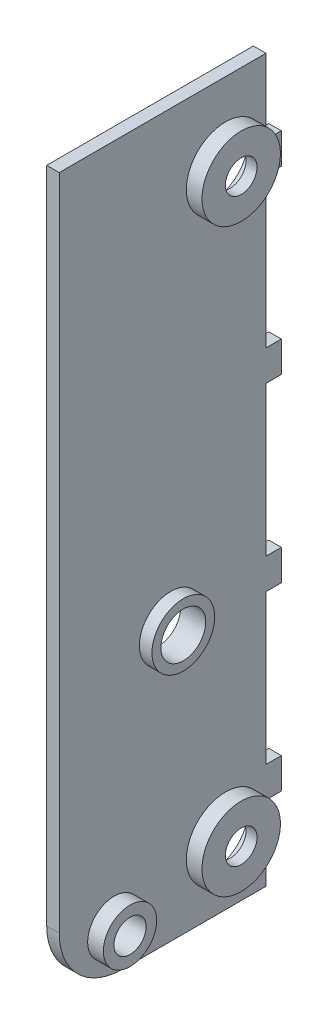
ISO-10303-21;
HEADER;
FILE_DESCRIPTION(('STEP AP214'),'2;1');
FILE_NAME('part.step','',(''),(''),'','','');
FILE_SCHEMA(('AUTOMOTIVE_DESIGN { 1 0 10303 214 1 1 1 1 }'));
ENDSEC;
DATA;
#1=APPLICATION_CONTEXT('core data for automotive mechanical design processes');
#2=APPLICATION_PROTOCOL_DEFINITION('international standard','automotive_design',2000,#1);
#3=PRODUCT_CONTEXT('',#1,'mechanical');
#4=PRODUCT('Part','Part','',(#3));
#5=PRODUCT_RELATED_PRODUCT_CATEGORY('part','',(#4));
#6=PRODUCT_DEFINITION_FORMATION('','',#4);
#7=PRODUCT_DEFINITION_CONTEXT('part definition',#1,'design');
#8=PRODUCT_DEFINITION('design','',#6,#7);
#9=PRODUCT_DEFINITION_SHAPE('','',#8);
#10=(LENGTH_UNIT() NAMED_UNIT(*) SI_UNIT(.MILLI.,.METRE.));
#11=(NAMED_UNIT(*) PLANE_ANGLE_UNIT() SI_UNIT($,.RADIAN.));
#12=(NAMED_UNIT(*) SI_UNIT($,.STERADIAN.) SOLID_ANGLE_UNIT());
#13=UNCERTAINTY_MEASURE_WITH_UNIT(LENGTH_MEASURE(1.E-05),#10,'distance_accuracy_value','');
#14=(GEOMETRIC_REPRESENTATION_CONTEXT(3) GLOBAL_UNCERTAINTY_ASSIGNED_CONTEXT((#13)) GLOBAL_UNIT_ASSIGNED_CONTEXT((#10,
#11,#12)) REPRESENTATION_CONTEXT('',''));
#15=CARTESIAN_POINT('',(0.,0.,0.));
#16=DIRECTION('',(0.,0.,1.));
#17=DIRECTION('',(1.,0.,0.));
#18=AXIS2_PLACEMENT_3D('',#15,#16,#17);
#19=CARTESIAN_POINT('',(-99.9999999999999,-95.,17.));
#20=DIRECTION('',(1.,0.,0.));
#21=DIRECTION('',(0.,0.,-1.));
#22=AXIS2_PLACEMENT_3D('',#19,#20,#21);
#23=CYLINDRICAL_SURFACE('',#22,5.05);
#24=CARTESIAN_POINT('',(105.,-95.,17.));
#25=DIRECTION('',(1.,0.,0.));
#26=DIRECTION('',(0.,0.,1.));
#27=AXIS2_PLACEMENT_3D('',#24,#25,#26);
#28=CIRCLE('',#27,5.05);
#29=CARTESIAN_POINT('',(105.,-95.,22.05));
#30=VERTEX_POINT('',#29);
#31=EDGE_CURVE('E633',#30,#30,#28,.T.);
#32=ORIENTED_EDGE('',*,*,#31,.T.);
#33=EDGE_LOOP('',(#32));
#34=FACE_BOUND('',#33,.T.);
#35=CARTESIAN_POINT('',(101.5,-95.,17.));
#36=DIRECTION('',(-1.,0.,0.));
#37=DIRECTION('',(0.,0.,1.));
#38=AXIS2_PLACEMENT_3D('',#35,#36,#37);
#39=CIRCLE('',#38,5.05);
#40=CARTESIAN_POINT('',(101.5,-95.,22.05));
#41=VERTEX_POINT('',#40);
#42=EDGE_CURVE('E43',#41,#41,#39,.F.);
#43=ORIENTED_EDGE('',*,*,#42,.F.);
#44=EDGE_LOOP('',(#43));
#45=FACE_BOUND('',#44,.T.);
#46=ADVANCED_FACE('F39',(#34,#45),#23,.F.);
#47=CARTESIAN_POINT('',(100.,-115.,70.));
#48=DIRECTION('',(-1.,0.,0.));
#49=DIRECTION('',(0.,0.,1.));
#50=AXIS2_PLACEMENT_3D('',#47,#48,#49);
#51=PLANE('',#50);
#52=CARTESIAN_POINT('',(100.,-28.4,34.45));
#53=DIRECTION('',(-1.,0.,0.));
#54=DIRECTION('',(0.,0.,1.));
#55=AXIS2_PLACEMENT_3D('',#52,#53,#54);
#56=CIRCLE('',#55,10.);
#57=CARTESIAN_POINT('',(100.,-28.4,44.45));
#58=VERTEX_POINT('',#57);
#59=EDGE_CURVE('E49',#58,#58,#56,.F.);
#60=ORIENTED_EDGE('',*,*,#59,.F.);
#61=EDGE_LOOP('',(#60));
#62=FACE_BOUND('',#61,.T.);
#63=DIRECTION('',(0.,0.,-1.));
#64=VECTOR('',#63,1.);
#65=CARTESIAN_POINT('',(100.,-115.,70.));
#66=LINE('',#65,#64);
#67=CARTESIAN_POINT('',(100.,-115.,50.));
#68=VERTEX_POINT('',#67);
#69=CARTESIAN_POINT('',(100.,-115.,4.1191106251155));
#70=VERTEX_POINT('',#69);
#71=EDGE_CURVE('E363',#68,#70,#66,.T.);
#72=ORIENTED_EDGE('',*,*,#71,.T.);
#73=DIRECTION('',(0.,1.,0.));
#74=VECTOR('',#73,1.);
#75=CARTESIAN_POINT('',(100.,-115.,4.1191106251155));
#76=LINE('',#75,#74);
#77=CARTESIAN_POINT('',(100.,-91.15,4.1191106251155));
#78=VERTEX_POINT('',#77);
#79=EDGE_CURVE('E354',#70,#78,#76,.T.);
#80=ORIENTED_EDGE('',*,*,#79,.T.);
#81=DIRECTION('',(0.,0.,1.));
#82=VECTOR('',#81,1.);
#83=CARTESIAN_POINT('',(100.,-91.15,-0.780889374884504));
#84=LINE('',#83,#82);
#85=CARTESIAN_POINT('',(100.,-91.15,-0.780889374884504));
#86=VERTEX_POINT('',#85);
#87=EDGE_CURVE('E335',#86,#78,#84,.T.);
#88=ORIENTED_EDGE('',*,*,#87,.F.);
#89=DIRECTION('',(0.,-1.,0.));
#90=VECTOR('',#89,1.);
#91=CARTESIAN_POINT('',(100.,-91.15,-0.780889374884504));
#92=LINE('',#91,#90);
#93=CARTESIAN_POINT('',(100.,-81.35,-0.780889374884504));
#94=VERTEX_POINT('',#93);
#95=EDGE_CURVE('E303',#94,#86,#92,.T.);
#96=ORIENTED_EDGE('',*,*,#95,.F.);
#97=DIRECTION('',(0.,0.,1.));
#98=VECTOR('',#97,1.);
#99=CARTESIAN_POINT('',(100.,-81.35,-0.780889374884504));
#100=LINE('',#99,#98);
#101=CARTESIAN_POINT('',(100.,-81.35,4.1191106251155));
#102=VERTEX_POINT('',#101);
#103=EDGE_CURVE('E317',#94,#102,#100,.T.);
#104=ORIENTED_EDGE('',*,*,#103,.T.);
#105=CARTESIAN_POINT('',(100.,-33.65,4.1191106251155));
#106=VERTEX_POINT('',#105);
#107=EDGE_CURVE('E396',#102,#106,#76,.T.);
#108=ORIENTED_EDGE('',*,*,#107,.T.);
#109=DIRECTION('',(0.,0.,1.));
#110=VECTOR('',#109,1.);
#111=CARTESIAN_POINT('',(100.,-33.65,-0.780889374884504));
#112=LINE('',#111,#110);
#113=CARTESIAN_POINT('',(100.,-33.65,-0.780889374884504));
#114=VERTEX_POINT('',#113);
#115=EDGE_CURVE('E299',#114,#106,#112,.T.);
#116=ORIENTED_EDGE('',*,*,#115,.F.);
#117=DIRECTION('',(0.,-1.,0.));
#118=VECTOR('',#117,1.);
#119=CARTESIAN_POINT('',(100.,-23.85,-0.780889374884504));
#120=LINE('',#119,#118);
#121=CARTESIAN_POINT('',(100.,-23.85,-0.780889374884504));
#122=VERTEX_POINT('',#121);
#123=EDGE_CURVE('E270',#122,#114,#120,.T.);
#124=ORIENTED_EDGE('',*,*,#123,.F.);
#125=DIRECTION('',(0.,0.,1.));
#126=VECTOR('',#125,1.);
#127=CARTESIAN_POINT('',(100.,-23.85,-0.780889374884504));
#128=LINE('',#127,#126);
#129=CARTESIAN_POINT('',(100.,-23.85,4.1191106251155));
#130=VERTEX_POINT('',#129);
#131=EDGE_CURVE('E284',#122,#130,#128,.T.);
#132=ORIENTED_EDGE('',*,*,#131,.T.);
#133=CARTESIAN_POINT('',(100.,23.85,4.1191106251155));
#134=VERTEX_POINT('',#133);
#135=EDGE_CURVE('E195',#130,#134,#76,.T.);
#136=ORIENTED_EDGE('',*,*,#135,.T.);
#137=DIRECTION('',(0.,0.,1.));
#138=VECTOR('',#137,1.);
#139=CARTESIAN_POINT('',(100.,23.85,-0.780889374884504));
#140=LINE('',#139,#138);
#141=CARTESIAN_POINT('',(100.,23.85,-0.780889374884504));
#142=VERTEX_POINT('',#141);
#143=EDGE_CURVE('E186',#142,#134,#140,.T.);
#144=ORIENTED_EDGE('',*,*,#143,.F.);
#145=DIRECTION('',(0.,1.,0.));
#146=VECTOR('',#145,1.);
#147=CARTESIAN_POINT('',(100.,23.85,-0.780889374884504));
#148=LINE('',#147,#146);
#149=CARTESIAN_POINT('',(100.,33.65,-0.780889374884504));
#150=VERTEX_POINT('',#149);
#151=EDGE_CURVE('E191',#142,#150,#148,.T.);
#152=ORIENTED_EDGE('',*,*,#151,.T.);
#153=DIRECTION('',(0.,0.,1.));
#154=VECTOR('',#153,1.);
#155=CARTESIAN_POINT('',(100.,33.65,-0.780889374884504));
#156=LINE('',#155,#154);
#157=CARTESIAN_POINT('',(100.,33.65,4.1191106251155));
#158=VERTEX_POINT('',#157);
#159=EDGE_CURVE('E221',#150,#158,#156,.T.);
#160=ORIENTED_EDGE('',*,*,#159,.T.);
#161=CARTESIAN_POINT('',(100.,81.35,4.1191106251155));
#162=VERTEX_POINT('',#161);
#163=EDGE_CURVE('E397',#158,#162,#76,.T.);
#164=ORIENTED_EDGE('',*,*,#163,.T.);
#165=DIRECTION('',(0.,0.,1.));
#166=VECTOR('',#165,1.);
#167=CARTESIAN_POINT('',(100.,81.35,-0.780889374884504));
#168=LINE('',#167,#166);
#169=CARTESIAN_POINT('',(100.,81.35,-0.780889374884504));
#170=VERTEX_POINT('',#169);
#171=EDGE_CURVE('E266',#170,#162,#168,.T.);
#172=ORIENTED_EDGE('',*,*,#171,.F.);
#173=DIRECTION('',(0.,1.,0.));
#174=VECTOR('',#173,1.);
#175=CARTESIAN_POINT('',(100.,91.15,-0.780889374884504));
#176=LINE('',#175,#174);
#177=CARTESIAN_POINT('',(100.,91.15,-0.780889374884504));
#178=VERTEX_POINT('',#177);
#179=EDGE_CURVE('E235',#170,#178,#176,.T.);
#180=ORIENTED_EDGE('',*,*,#179,.T.);
#181=DIRECTION('',(0.,0.,1.));
#182=VECTOR('',#181,1.);
#183=CARTESIAN_POINT('',(100.,91.15,-0.780889374884504));
#184=LINE('',#183,#182);
#185=CARTESIAN_POINT('',(100.,91.15,4.1191106251155));
#186=VERTEX_POINT('',#185);
#187=EDGE_CURVE('E252',#178,#186,#184,.T.);
#188=ORIENTED_EDGE('',*,*,#187,.T.);
#189=CARTESIAN_POINT('',(100.,115.,4.1191106251155));
#190=VERTEX_POINT('',#189);
#191=EDGE_CURVE('E366',#186,#190,#76,.T.);
#192=ORIENTED_EDGE('',*,*,#191,.T.);
#193=DIRECTION('',(0.,0.,-1.));
#194=VECTOR('',#193,1.);
#195=CARTESIAN_POINT('',(100.,115.,70.));
#196=LINE('',#195,#194);
#197=CARTESIAN_POINT('',(100.,115.,70.));
#198=VERTEX_POINT('',#197);
#199=EDGE_CURVE('E339',#198,#190,#196,.T.);
#200=ORIENTED_EDGE('',*,*,#199,.F.);
#201=DIRECTION('',(0.,1.,0.));
#202=VECTOR('',#201,1.);
#203=CARTESIAN_POINT('',(100.,-115.,70.));
#204=LINE('',#203,#202);
#205=CARTESIAN_POINT('',(100.,-95.,70.));
#206=VERTEX_POINT('',#205);
#207=EDGE_CURVE('E359',#206,#198,#204,.T.);
#208=ORIENTED_EDGE('',*,*,#207,.F.);
#209=CARTESIAN_POINT('',(100.,-95.,50.));
#210=DIRECTION('',(-1.,0.,0.));
#211=DIRECTION('',(0.,0.,1.));
#212=AXIS2_PLACEMENT_3D('',#209,#210,#211);
#213=CIRCLE('',#212,20.);
#214=EDGE_CURVE('E350',#206,#68,#213,.F.);
#215=ORIENTED_EDGE('',*,*,#214,.T.);
#216=EDGE_LOOP('',(#72,#80,#88,#96,#104,#108,#116,#124,#132,#136,#144,#152,#160,#164,#172,#180,
#188,#192,#200,#208,#215));
#217=FACE_BOUND('',#216,.T.);
#218=CARTESIAN_POINT('',(100.,90.,17.));
#219=DIRECTION('',(-1.,0.,0.));
#220=DIRECTION('',(0.,0.,1.));
#221=AXIS2_PLACEMENT_3D('',#218,#219,#220);
#222=CIRCLE('',#221,12.5);
#223=CARTESIAN_POINT('',(100.,90.,29.5));
#224=VERTEX_POINT('',#223);
#225=EDGE_CURVE('E224',#224,#224,#222,.T.);
#226=ORIENTED_EDGE('',*,*,#225,.T.);
#227=EDGE_LOOP('',(#226));
#228=FACE_BOUND('',#227,.T.);
#229=CARTESIAN_POINT('',(100.,-102.,52.45));
#230=DIRECTION('',(-1.,0.,0.));
#231=DIRECTION('',(0.,0.,1.));
#232=AXIS2_PLACEMENT_3D('',#229,#230,#231);
#233=CIRCLE('',#232,8.5);
#234=CARTESIAN_POINT('',(100.,-102.,60.95));
#235=VERTEX_POINT('',#234);
#236=EDGE_CURVE('E407',#235,#235,#233,.F.);
#237=ORIENTED_EDGE('',*,*,#236,.F.);
#238=EDGE_LOOP('',(#237));
#239=FACE_BOUND('',#238,.T.);
#240=CARTESIAN_POINT('',(100.,-95.,17.));
#241=DIRECTION('',(-1.,0.,0.));
#242=DIRECTION('',(0.,0.,1.));
#243=AXIS2_PLACEMENT_3D('',#240,#241,#242);
#244=CIRCLE('',#243,12.5);
#245=CARTESIAN_POINT('',(100.,-95.,29.5));
#246=VERTEX_POINT('',#245);
#247=EDGE_CURVE('E11',#246,#246,#244,.F.);
#248=ORIENTED_EDGE('',*,*,#247,.F.);
#249=EDGE_LOOP('',(#248));
#250=FACE_BOUND('',#249,.T.);
#251=ADVANCED_FACE('F189',(#62,#217,#228,#239,#250),#51,.F.);
#252=CARTESIAN_POINT('',(-99.9999999999999,90.,17.));
#253=DIRECTION('',(1.,0.,0.));
#254=DIRECTION('',(0.,0.,-1.));
#255=AXIS2_PLACEMENT_3D('',#252,#253,#254);
#256=CYLINDRICAL_SURFACE('',#255,5.05);
#257=CARTESIAN_POINT('',(105.,90.,17.));
#258=DIRECTION('',(-1.,0.,0.));
#259=DIRECTION('',(0.,0.,1.));
#260=AXIS2_PLACEMENT_3D('',#257,#258,#259);
#261=CIRCLE('',#260,5.05);
#262=CARTESIAN_POINT('',(105.,90.,22.05));
#263=VERTEX_POINT('',#262);
#264=EDGE_CURVE('E447',#263,#263,#261,.T.);
#265=ORIENTED_EDGE('',*,*,#264,.F.);
#266=EDGE_LOOP('',(#265));
#267=FACE_BOUND('',#266,.T.);
#268=CARTESIAN_POINT('',(101.5,90.,17.));
#269=DIRECTION('',(-1.,0.,0.));
#270=DIRECTION('',(0.,0.,1.));
#271=AXIS2_PLACEMENT_3D('',#268,#269,#270);
#272=CIRCLE('',#271,5.05);
#273=CARTESIAN_POINT('',(101.5,90.,22.05));
#274=VERTEX_POINT('',#273);
#275=EDGE_CURVE('E413',#274,#274,#272,.F.);
#276=ORIENTED_EDGE('',*,*,#275,.F.);
#277=EDGE_LOOP('',(#276));
#278=FACE_BOUND('',#277,.T.);
#279=ADVANCED_FACE('F479',(#267,#278),#256,.F.);
#280=CARTESIAN_POINT('',(100.,-115.,4.1191106251155));
#281=DIRECTION('',(0.,0.,1.));
#282=DIRECTION('',(1.,0.,0.));
#283=AXIS2_PLACEMENT_3D('',#280,#281,#282);
#284=PLANE('',#283);
#285=DIRECTION('',(0.,-1.,0.));
#286=VECTOR('',#285,1.);
#287=CARTESIAN_POINT('',(95.9999999999999,-111.,4.1191106251155));
#288=LINE('',#287,#286);
#289=CARTESIAN_POINT('',(95.9999999999999,23.85,4.1191106251155));
#290=VERTEX_POINT('',#289);
#291=CARTESIAN_POINT('',(95.9999999999999,-23.85,4.1191106251155));
#292=VERTEX_POINT('',#291);
#293=EDGE_CURVE('E392',#290,#292,#288,.T.);
#294=ORIENTED_EDGE('',*,*,#293,.F.);
#295=DIRECTION('',(1.,0.,0.));
#296=VECTOR('',#295,1.);
#297=CARTESIAN_POINT('',(100.,23.85,4.1191106251155));
#298=LINE('',#297,#296);
#299=EDGE_CURVE('E57',#290,#134,#298,.T.);
#300=ORIENTED_EDGE('',*,*,#299,.T.);
#301=ORIENTED_EDGE('',*,*,#135,.F.);
#302=DIRECTION('',(1.,0.,0.));
#303=VECTOR('',#302,1.);
#304=CARTESIAN_POINT('',(100.,-23.85,4.1191106251155));
#305=LINE('',#304,#303);
#306=EDGE_CURVE('E275',#292,#130,#305,.T.);
#307=ORIENTED_EDGE('',*,*,#306,.F.);
#308=EDGE_LOOP('',(#294,#300,#301,#307));
#309=FACE_BOUND('',#308,.T.);
#310=ADVANCED_FACE('F490',(#309),#284,.F.);
#311=ORIENTED_EDGE('',*,*,#163,.F.);
#312=DIRECTION('',(-1.,0.,0.));
#313=VECTOR('',#312,1.);
#314=CARTESIAN_POINT('',(100.,33.65,4.1191106251155));
#315=LINE('',#314,#313);
#316=CARTESIAN_POINT('',(95.9999999999999,33.65,4.1191106251155));
#317=VERTEX_POINT('',#316);
#318=EDGE_CURVE('E209',#158,#317,#315,.T.);
#319=ORIENTED_EDGE('',*,*,#318,.T.);
#320=CARTESIAN_POINT('',(95.9999999999999,81.35,4.1191106251155));
#321=VERTEX_POINT('',#320);
#322=EDGE_CURVE('E391',#321,#317,#288,.T.);
#323=ORIENTED_EDGE('',*,*,#322,.F.);
#324=DIRECTION('',(1.,0.,0.));
#325=VECTOR('',#324,1.);
#326=CARTESIAN_POINT('',(100.,81.35,4.1191106251155));
#327=LINE('',#326,#325);
#328=EDGE_CURVE('E65',#321,#162,#327,.T.);
#329=ORIENTED_EDGE('',*,*,#328,.T.);
#330=EDGE_LOOP('',(#311,#319,#323,#329));
#331=FACE_BOUND('',#330,.T.);
#332=ADVANCED_FACE('F563',(#331),#284,.F.);
#333=DIRECTION('',(-1.,0.,0.));
#334=VECTOR('',#333,1.);
#335=CARTESIAN_POINT('',(100.,-33.65,4.1191106251155));
#336=LINE('',#335,#334);
#337=CARTESIAN_POINT('',(95.9999999999999,-33.65,4.1191106251155));
#338=VERTEX_POINT('',#337);
#339=EDGE_CURVE('E269',#106,#338,#336,.T.);
#340=ORIENTED_EDGE('',*,*,#339,.F.);
#341=ORIENTED_EDGE('',*,*,#107,.F.);
#342=DIRECTION('',(1.,0.,0.));
#343=VECTOR('',#342,1.);
#344=CARTESIAN_POINT('',(100.,-81.35,4.1191106251155));
#345=LINE('',#344,#343);
#346=CARTESIAN_POINT('',(95.9999999999999,-81.35,4.1191106251155));
#347=VERTEX_POINT('',#346);
#348=EDGE_CURVE('E308',#347,#102,#345,.T.);
#349=ORIENTED_EDGE('',*,*,#348,.F.);
#350=EDGE_CURVE('E552',#338,#347,#288,.T.);
#351=ORIENTED_EDGE('',*,*,#350,.F.);
#352=EDGE_LOOP('',(#340,#341,#349,#351));
#353=FACE_BOUND('',#352,.T.);
#354=ADVANCED_FACE('F41',(#353),#284,.F.);
#355=ORIENTED_EDGE('',*,*,#191,.F.);
#356=DIRECTION('',(-1.,0.,0.));
#357=VECTOR('',#356,1.);
#358=CARTESIAN_POINT('',(100.,91.15,4.1191106251155));
#359=LINE('',#358,#357);
#360=CARTESIAN_POINT('',(95.9999999999999,91.15,4.1191106251155));
#361=VERTEX_POINT('',#360);
#362=EDGE_CURVE('E240',#186,#361,#359,.T.);
#363=ORIENTED_EDGE('',*,*,#362,.T.);
#364=CARTESIAN_POINT('',(95.9999999999999,115.,4.1191106251155));
#365=VERTEX_POINT('',#364);
#366=EDGE_CURVE('E344',#365,#361,#288,.T.);
#367=ORIENTED_EDGE('',*,*,#366,.F.);
#368=DIRECTION('',(1.,0.,0.));
#369=VECTOR('',#368,1.);
#370=CARTESIAN_POINT('',(100.,115.,4.1191106251155));
#371=LINE('',#370,#369);
#372=EDGE_CURVE('E372',#365,#190,#371,.T.);
#373=ORIENTED_EDGE('',*,*,#372,.T.);
#374=EDGE_LOOP('',(#355,#363,#367,#373));
#375=FACE_BOUND('',#374,.T.);
#376=ADVANCED_FACE('F511',(#375),#284,.F.);
#377=DIRECTION('',(-1.,0.,0.));
#378=VECTOR('',#377,1.);
#379=CARTESIAN_POINT('',(100.,-91.15,4.1191106251155));
#380=LINE('',#379,#378);
#381=CARTESIAN_POINT('',(95.9999999999999,-91.15,4.1191106251155));
#382=VERTEX_POINT('',#381);
#383=EDGE_CURVE('E302',#78,#382,#380,.T.);
#384=ORIENTED_EDGE('',*,*,#383,.F.);
#385=ORIENTED_EDGE('',*,*,#79,.F.);
#386=DIRECTION('',(1.,0.,0.));
#387=VECTOR('',#386,1.);
#388=CARTESIAN_POINT('',(100.,-115.,4.1191106251155));
#389=LINE('',#388,#387);
#390=CARTESIAN_POINT('',(96.0000000000001,-115.,4.1191106251155));
#391=VERTEX_POINT('',#390);
#392=EDGE_CURVE('E349',#391,#70,#389,.T.);
#393=ORIENTED_EDGE('',*,*,#392,.F.);
#394=EDGE_CURVE('E377',#382,#391,#288,.T.);
#395=ORIENTED_EDGE('',*,*,#394,.F.);
#396=EDGE_LOOP('',(#384,#385,#393,#395));
#397=FACE_BOUND('',#396,.T.);
#398=ADVANCED_FACE('F504',(#397),#284,.F.);
#399=CARTESIAN_POINT('',(-99.9999999999999,115.,70.));
#400=DIRECTION('',(0.,-1.,0.));
#401=DIRECTION('',(0.,0.,-1.));
#402=AXIS2_PLACEMENT_3D('',#399,#400,#401);
#403=PLANE('',#402);
#404=ORIENTED_EDGE('',*,*,#199,.T.);
#405=ORIENTED_EDGE('',*,*,#372,.F.);
#406=DIRECTION('',(0.,0.,-1.));
#407=VECTOR('',#406,1.);
#408=CARTESIAN_POINT('',(96.0000000000001,115.,70.));
#409=LINE('',#408,#407);
#410=CARTESIAN_POINT('',(96.0000000000001,115.,70.));
#411=VERTEX_POINT('',#410);
#412=EDGE_CURVE('E373',#411,#365,#409,.T.);
#413=ORIENTED_EDGE('',*,*,#412,.F.);
#414=DIRECTION('',(-1.,0.,0.));
#415=VECTOR('',#414,1.);
#416=CARTESIAN_POINT('',(-99.9999999999999,115.,70.));
#417=LINE('',#416,#415);
#418=EDGE_CURVE('E367',#198,#411,#417,.T.);
#419=ORIENTED_EDGE('',*,*,#418,.F.);
#420=EDGE_LOOP('',(#404,#405,#413,#419));
#421=FACE_BOUND('',#420,.T.);
#422=ADVANCED_FACE('F502',(#421),#403,.F.);
#423=CARTESIAN_POINT('',(0.,0.,70.));
#424=DIRECTION('',(0.,0.,-1.));
#425=DIRECTION('',(-1.,0.,0.));
#426=AXIS2_PLACEMENT_3D('',#423,#424,#425);
#427=PLANE('',#426);
#428=DIRECTION('',(0.,1.,0.));
#429=VECTOR('',#428,1.);
#430=CARTESIAN_POINT('',(95.9999999999999,-111.,70.));
#431=LINE('',#430,#429);
#432=CARTESIAN_POINT('',(95.9999999999999,-95.,70.));
#433=VERTEX_POINT('',#432);
#434=EDGE_CURVE('E343',#433,#411,#431,.T.);
#435=ORIENTED_EDGE('',*,*,#434,.F.);
#436=DIRECTION('',(1.,0.,0.));
#437=VECTOR('',#436,1.);
#438=CARTESIAN_POINT('',(0.,-95.,70.));
#439=LINE('',#438,#437);
#440=EDGE_CURVE('E355',#433,#206,#439,.T.);
#441=ORIENTED_EDGE('',*,*,#440,.T.);
#442=ORIENTED_EDGE('',*,*,#207,.T.);
#443=ORIENTED_EDGE('',*,*,#418,.T.);
#444=EDGE_LOOP('',(#435,#441,#442,#443));
#445=FACE_BOUND('',#444,.T.);
#446=ADVANCED_FACE('F500',(#445),#427,.F.);
#447=CARTESIAN_POINT('',(-99.9999999999999,-115.,70.));
#448=DIRECTION('',(0.,1.,0.));
#449=DIRECTION('',(0.,0.,1.));
#450=AXIS2_PLACEMENT_3D('',#447,#448,#449);
#451=PLANE('',#450);
#452=DIRECTION('',(0.,0.,-1.));
#453=VECTOR('',#452,1.);
#454=CARTESIAN_POINT('',(96.0000000000001,-115.,70.));
#455=LINE('',#454,#453);
#456=CARTESIAN_POINT('',(96.0000000000001,-115.,50.));
#457=VERTEX_POINT('',#456);
#458=EDGE_CURVE('E353',#457,#391,#455,.T.);
#459=ORIENTED_EDGE('',*,*,#458,.T.);
#460=ORIENTED_EDGE('',*,*,#392,.T.);
#461=ORIENTED_EDGE('',*,*,#71,.F.);
#462=DIRECTION('',(1.,0.,0.));
#463=VECTOR('',#462,1.);
#464=CARTESIAN_POINT('',(-99.9999999999999,-115.,50.));
#465=LINE('',#464,#463);
#466=EDGE_CURVE('E345',#68,#457,#465,.F.);
#467=ORIENTED_EDGE('',*,*,#466,.T.);
#468=EDGE_LOOP('',(#459,#460,#461,#467));
#469=FACE_BOUND('',#468,.T.);
#470=ADVANCED_FACE('F497',(#469),#451,.F.);
#471=CARTESIAN_POINT('',(95.9999999999999,-111.,4.));
#472=DIRECTION('',(1.,0.,0.));
#473=DIRECTION('',(0.,0.,-1.));
#474=AXIS2_PLACEMENT_3D('',#471,#472,#473);
#475=PLANE('',#474);
#476=CARTESIAN_POINT('',(95.9999999999999,-95.,17.));
#477=DIRECTION('',(1.,0.,0.));
#478=DIRECTION('',(0.,0.,1.));
#479=AXIS2_PLACEMENT_3D('',#476,#477,#478);
#480=CIRCLE('',#479,11.2);
#481=CARTESIAN_POINT('',(95.9999999999999,-95.,28.2));
#482=VERTEX_POINT('',#481);
#483=EDGE_CURVE('E624',#482,#482,#480,.T.);
#484=ORIENTED_EDGE('',*,*,#483,.T.);
#485=EDGE_LOOP('',(#484));
#486=FACE_BOUND('',#485,.T.);
#487=ORIENTED_EDGE('',*,*,#412,.T.);
#488=ORIENTED_EDGE('',*,*,#366,.T.);
#489=DIRECTION('',(0.,0.,1.));
#490=VECTOR('',#489,1.);
#491=CARTESIAN_POINT('',(95.9999999999999,91.15,-0.780889374884504));
#492=LINE('',#491,#490);
#493=CARTESIAN_POINT('',(95.9999999999999,91.15,-0.780889374884504));
#494=VERTEX_POINT('',#493);
#495=EDGE_CURVE('E260',#494,#361,#492,.T.);
#496=ORIENTED_EDGE('',*,*,#495,.F.);
#497=DIRECTION('',(0.,-1.,0.));
#498=VECTOR('',#497,1.);
#499=CARTESIAN_POINT('',(95.9999999999999,91.15,-0.780889374884504));
#500=LINE('',#499,#498);
#501=CARTESIAN_POINT('',(95.9999999999999,81.35,-0.780889374884504));
#502=VERTEX_POINT('',#501);
#503=EDGE_CURVE('E244',#494,#502,#500,.T.);
#504=ORIENTED_EDGE('',*,*,#503,.T.);
#505=DIRECTION('',(0.,0.,1.));
#506=VECTOR('',#505,1.);
#507=CARTESIAN_POINT('',(95.9999999999999,81.35,-0.780889374884504));
#508=LINE('',#507,#506);
#509=EDGE_CURVE('E263',#502,#321,#508,.T.);
#510=ORIENTED_EDGE('',*,*,#509,.T.);
#511=ORIENTED_EDGE('',*,*,#322,.T.);
#512=DIRECTION('',(0.,0.,1.));
#513=VECTOR('',#512,1.);
#514=CARTESIAN_POINT('',(95.9999999999999,33.65,-0.780889374884504));
#515=LINE('',#514,#513);
#516=CARTESIAN_POINT('',(95.9999999999999,33.65,-0.780889374884504));
#517=VERTEX_POINT('',#516);
#518=EDGE_CURVE('E230',#517,#317,#515,.T.);
#519=ORIENTED_EDGE('',*,*,#518,.F.);
#520=DIRECTION('',(0.,-1.,0.));
#521=VECTOR('',#520,1.);
#522=CARTESIAN_POINT('',(95.9999999999999,23.85,-0.780889374884504));
#523=LINE('',#522,#521);
#524=CARTESIAN_POINT('',(95.9999999999999,23.85,-0.780889374884504));
#525=VERTEX_POINT('',#524);
#526=EDGE_CURVE('E213',#517,#525,#523,.T.);
#527=ORIENTED_EDGE('',*,*,#526,.T.);
#528=DIRECTION('',(0.,0.,1.));
#529=VECTOR('',#528,1.);
#530=CARTESIAN_POINT('',(95.9999999999999,23.85,-0.780889374884504));
#531=LINE('',#530,#529);
#532=EDGE_CURVE('E198',#525,#290,#531,.T.);
#533=ORIENTED_EDGE('',*,*,#532,.T.);
#534=ORIENTED_EDGE('',*,*,#293,.T.);
#535=DIRECTION('',(0.,0.,1.));
#536=VECTOR('',#535,1.);
#537=CARTESIAN_POINT('',(95.9999999999999,-23.85,-0.780889374884504));
#538=LINE('',#537,#536);
#539=CARTESIAN_POINT('',(95.9999999999999,-23.85,-0.780889374884504));
#540=VERTEX_POINT('',#539);
#541=EDGE_CURVE('E292',#540,#292,#538,.T.);
#542=ORIENTED_EDGE('',*,*,#541,.F.);
#543=DIRECTION('',(0.,1.,0.));
#544=VECTOR('',#543,1.);
#545=CARTESIAN_POINT('',(95.9999999999999,-23.85,-0.780889374884504));
#546=LINE('',#545,#544);
#547=CARTESIAN_POINT('',(95.9999999999999,-33.65,-0.780889374884504));
#548=VERTEX_POINT('',#547);
#549=EDGE_CURVE('E278',#548,#540,#546,.T.);
#550=ORIENTED_EDGE('',*,*,#549,.F.);
#551=DIRECTION('',(0.,0.,1.));
#552=VECTOR('',#551,1.);
#553=CARTESIAN_POINT('',(95.9999999999999,-33.65,-0.780889374884504));
#554=LINE('',#553,#552);
#555=EDGE_CURVE('E296',#548,#338,#554,.T.);
#556=ORIENTED_EDGE('',*,*,#555,.T.);
#557=ORIENTED_EDGE('',*,*,#350,.T.);
#558=DIRECTION('',(0.,0.,1.));
#559=VECTOR('',#558,1.);
#560=CARTESIAN_POINT('',(95.9999999999999,-81.35,-0.780889374884504));
#561=LINE('',#560,#559);
#562=CARTESIAN_POINT('',(95.9999999999999,-81.35,-0.780889374884504));
#563=VERTEX_POINT('',#562);
#564=EDGE_CURVE('E327',#563,#347,#561,.T.);
#565=ORIENTED_EDGE('',*,*,#564,.F.);
#566=DIRECTION('',(0.,1.,0.));
#567=VECTOR('',#566,1.);
#568=CARTESIAN_POINT('',(95.9999999999999,-91.15,-0.780889374884504));
#569=LINE('',#568,#567);
#570=CARTESIAN_POINT('',(95.9999999999999,-91.15,-0.780889374884504));
#571=VERTEX_POINT('',#570);
#572=EDGE_CURVE('E311',#571,#563,#569,.T.);
#573=ORIENTED_EDGE('',*,*,#572,.F.);
#574=DIRECTION('',(0.,0.,1.));
#575=VECTOR('',#574,1.);
#576=CARTESIAN_POINT('',(95.9999999999999,-91.15,-0.780889374884504));
#577=LINE('',#576,#575);
#578=EDGE_CURVE('E331',#571,#382,#577,.T.);
#579=ORIENTED_EDGE('',*,*,#578,.T.);
#580=ORIENTED_EDGE('',*,*,#394,.T.);
#581=ORIENTED_EDGE('',*,*,#458,.F.);
#582=CARTESIAN_POINT('',(95.9999999999999,-95.,50.));
#583=DIRECTION('',(1.,0.,0.));
#584=DIRECTION('',(0.,0.,-1.));
#585=AXIS2_PLACEMENT_3D('',#582,#583,#584);
#586=CIRCLE('',#585,20.);
#587=EDGE_CURVE('E340',#457,#433,#586,.F.);
#588=ORIENTED_EDGE('',*,*,#587,.T.);
#589=ORIENTED_EDGE('',*,*,#434,.T.);
#590=EDGE_LOOP('',(#487,#488,#496,#504,#510,#511,#519,#527,#533,#534,#542,#550,#556,#557,#565,
#573,#579,#580,#581,#588,#589));
#591=FACE_BOUND('',#590,.T.);
#592=CARTESIAN_POINT('',(95.9999999999999,-28.4,34.45));
#593=DIRECTION('',(1.,0.,0.));
#594=DIRECTION('',(0.,0.,-1.));
#595=AXIS2_PLACEMENT_3D('',#592,#593,#594);
#596=CIRCLE('',#595,7.15);
#597=CARTESIAN_POINT('',(95.9999999999999,-28.4,27.3));
#598=VERTEX_POINT('',#597);
#599=EDGE_CURVE('E378',#598,#598,#596,.T.);
#600=ORIENTED_EDGE('',*,*,#599,.T.);
#601=EDGE_LOOP('',(#600));
#602=FACE_BOUND('',#601,.T.);
#603=CARTESIAN_POINT('',(95.9999999999999,-102.,52.45));
#604=DIRECTION('',(1.,0.,0.));
#605=DIRECTION('',(0.,0.,-1.));
#606=AXIS2_PLACEMENT_3D('',#603,#604,#605);
#607=CIRCLE('',#606,5.15);
#608=CARTESIAN_POINT('',(95.9999999999999,-102.,47.3));
#609=VERTEX_POINT('',#608);
#610=EDGE_CURVE('E348',#609,#609,#607,.T.);
#611=ORIENTED_EDGE('',*,*,#610,.T.);
#612=EDGE_LOOP('',(#611));
#613=FACE_BOUND('',#612,.T.);
#614=CARTESIAN_POINT('',(95.9999999999999,90.,17.));
#615=DIRECTION('',(-1.,0.,0.));
#616=DIRECTION('',(0.,0.,1.));
#617=AXIS2_PLACEMENT_3D('',#614,#615,#616);
#618=CIRCLE('',#617,11.2);
#619=CARTESIAN_POINT('',(95.9999999999999,90.,28.2));
#620=VERTEX_POINT('',#619);
#621=EDGE_CURVE('E426',#620,#620,#618,.T.);
#622=ORIENTED_EDGE('',*,*,#621,.F.);
#623=EDGE_LOOP('',(#622));
#624=FACE_BOUND('',#623,.T.);
#625=ADVANCED_FACE('F499',(#486,#591,#602,#613,#624),#475,.F.);
#626=CARTESIAN_POINT('',(-99.9999999999999,-28.4,34.45));
#627=DIRECTION('',(1.,0.,0.));
#628=DIRECTION('',(0.,0.,-1.));
#629=AXIS2_PLACEMENT_3D('',#626,#627,#628);
#630=CYLINDRICAL_SURFACE('',#629,7.15);
#631=ORIENTED_EDGE('',*,*,#599,.F.);
#632=EDGE_LOOP('',(#631));
#633=FACE_BOUND('',#632,.T.);
#634=CARTESIAN_POINT('',(104.,-28.4,34.45));
#635=DIRECTION('',(1.,0.,0.));
#636=DIRECTION('',(0.,0.,-1.));
#637=AXIS2_PLACEMENT_3D('',#634,#635,#636);
#638=CIRCLE('',#637,7.15);
#639=CARTESIAN_POINT('',(104.,-28.4,27.3));
#640=VERTEX_POINT('',#639);
#641=EDGE_CURVE('E416',#640,#640,#638,.T.);
#642=ORIENTED_EDGE('',*,*,#641,.T.);
#643=EDGE_LOOP('',(#642));
#644=FACE_BOUND('',#643,.T.);
#645=ADVANCED_FACE('F486',(#633,#644),#630,.F.);
#646=CARTESIAN_POINT('',(-99.9999999999999,-102.,52.45));
#647=DIRECTION('',(1.,0.,0.));
#648=DIRECTION('',(0.,0.,-1.));
#649=AXIS2_PLACEMENT_3D('',#646,#647,#648);
#650=CYLINDRICAL_SURFACE('',#649,5.15);
#651=ORIENTED_EDGE('',*,*,#610,.F.);
#652=EDGE_LOOP('',(#651));
#653=FACE_BOUND('',#652,.T.);
#654=CARTESIAN_POINT('',(105.,-102.,52.45));
#655=DIRECTION('',(1.,0.,0.));
#656=DIRECTION('',(0.,0.,-1.));
#657=AXIS2_PLACEMENT_3D('',#654,#655,#656);
#658=CIRCLE('',#657,5.15);
#659=CARTESIAN_POINT('',(105.,-102.,47.3));
#660=VERTEX_POINT('',#659);
#661=EDGE_CURVE('E439',#660,#660,#658,.T.);
#662=ORIENTED_EDGE('',*,*,#661,.T.);
#663=EDGE_LOOP('',(#662));
#664=FACE_BOUND('',#663,.T.);
#665=ADVANCED_FACE('F492',(#653,#664),#650,.F.);
#666=CARTESIAN_POINT('',(0.,-95.,50.));
#667=DIRECTION('',(1.,0.,0.));
#668=DIRECTION('',(0.,0.,-1.));
#669=AXIS2_PLACEMENT_3D('',#666,#667,#668);
#670=CYLINDRICAL_SURFACE('',#669,20.);
#671=ORIENTED_EDGE('',*,*,#587,.F.);
#672=ORIENTED_EDGE('',*,*,#466,.F.);
#673=ORIENTED_EDGE('',*,*,#214,.F.);
#674=ORIENTED_EDGE('',*,*,#440,.F.);
#675=EDGE_LOOP('',(#671,#672,#673,#674));
#676=FACE_BOUND('',#675,.T.);
#677=ADVANCED_FACE('F495',(#676),#670,.T.);
#678=CARTESIAN_POINT('',(100.,-91.15,-0.780889374884504));
#679=DIRECTION('',(0.,1.,0.));
#680=DIRECTION('',(0.,0.,1.));
#681=AXIS2_PLACEMENT_3D('',#678,#679,#680);
#682=PLANE('',#681);
#683=ORIENTED_EDGE('',*,*,#383,.T.);
#684=ORIENTED_EDGE('',*,*,#578,.F.);
#685=DIRECTION('',(-1.,0.,0.));
#686=VECTOR('',#685,1.);
#687=CARTESIAN_POINT('',(100.,-91.15,-0.780889374884504));
#688=LINE('',#687,#686);
#689=EDGE_CURVE('E307',#86,#571,#688,.T.);
#690=ORIENTED_EDGE('',*,*,#689,.F.);
#691=ORIENTED_EDGE('',*,*,#87,.T.);
#692=EDGE_LOOP('',(#683,#684,#690,#691));
#693=FACE_BOUND('',#692,.T.);
#694=ADVANCED_FACE('F536',(#693),#682,.F.);
#695=CARTESIAN_POINT('',(100.,-81.35,-0.780889374884504));
#696=DIRECTION('',(0.,-1.,0.));
#697=DIRECTION('',(0.,0.,-1.));
#698=AXIS2_PLACEMENT_3D('',#695,#696,#697);
#699=PLANE('',#698);
#700=ORIENTED_EDGE('',*,*,#348,.T.);
#701=ORIENTED_EDGE('',*,*,#103,.F.);
#702=DIRECTION('',(1.,0.,0.));
#703=VECTOR('',#702,1.);
#704=CARTESIAN_POINT('',(100.,-81.35,-0.780889374884504));
#705=LINE('',#704,#703);
#706=EDGE_CURVE('E314',#563,#94,#705,.T.);
#707=ORIENTED_EDGE('',*,*,#706,.F.);
#708=ORIENTED_EDGE('',*,*,#564,.T.);
#709=EDGE_LOOP('',(#700,#701,#707,#708));
#710=FACE_BOUND('',#709,.T.);
#711=ADVANCED_FACE('F546',(#710),#699,.F.);
#712=CARTESIAN_POINT('',(0.,0.,-0.780889374884504));
#713=DIRECTION('',(0.,0.,1.));
#714=DIRECTION('',(1.,0.,0.));
#715=AXIS2_PLACEMENT_3D('',#712,#713,#714);
#716=PLANE('',#715);
#717=ORIENTED_EDGE('',*,*,#95,.T.);
#718=ORIENTED_EDGE('',*,*,#689,.T.);
#719=ORIENTED_EDGE('',*,*,#572,.T.);
#720=ORIENTED_EDGE('',*,*,#706,.T.);
#721=EDGE_LOOP('',(#717,#718,#719,#720));
#722=FACE_BOUND('',#721,.T.);
#723=ADVANCED_FACE('F540',(#722),#716,.F.);
#724=CARTESIAN_POINT('',(100.,-33.65,-0.780889374884504));
#725=DIRECTION('',(0.,1.,0.));
#726=DIRECTION('',(-1.,0.,0.));
#727=AXIS2_PLACEMENT_3D('',#724,#725,#726);
#728=PLANE('',#727);
#729=ORIENTED_EDGE('',*,*,#339,.T.);
#730=ORIENTED_EDGE('',*,*,#555,.F.);
#731=DIRECTION('',(-1.,0.,0.));
#732=VECTOR('',#731,1.);
#733=CARTESIAN_POINT('',(100.,-33.65,-0.780889374884504));
#734=LINE('',#733,#732);
#735=EDGE_CURVE('E274',#114,#548,#734,.T.);
#736=ORIENTED_EDGE('',*,*,#735,.F.);
#737=ORIENTED_EDGE('',*,*,#115,.T.);
#738=EDGE_LOOP('',(#729,#730,#736,#737));
#739=FACE_BOUND('',#738,.T.);
#740=ADVANCED_FACE('F573',(#739),#728,.F.);
#741=CARTESIAN_POINT('',(100.,-23.85,-0.780889374884504));
#742=DIRECTION('',(0.,-1.,0.));
#743=DIRECTION('',(1.,0.,0.));
#744=AXIS2_PLACEMENT_3D('',#741,#742,#743);
#745=PLANE('',#744);
#746=ORIENTED_EDGE('',*,*,#306,.T.);
#747=ORIENTED_EDGE('',*,*,#131,.F.);
#748=DIRECTION('',(1.,0.,0.));
#749=VECTOR('',#748,1.);
#750=CARTESIAN_POINT('',(100.,-23.85,-0.780889374884504));
#751=LINE('',#750,#749);
#752=EDGE_CURVE('E281',#540,#122,#751,.T.);
#753=ORIENTED_EDGE('',*,*,#752,.F.);
#754=ORIENTED_EDGE('',*,*,#541,.T.);
#755=EDGE_LOOP('',(#746,#747,#753,#754));
#756=FACE_BOUND('',#755,.T.);
#757=ADVANCED_FACE('F580',(#756),#745,.F.);
#758=CARTESIAN_POINT('',(0.,0.,-0.780889374884504));
#759=DIRECTION('',(0.,0.,-1.));
#760=DIRECTION('',(-1.,0.,0.));
#761=AXIS2_PLACEMENT_3D('',#758,#759,#760);
#762=PLANE('',#761);
#763=ORIENTED_EDGE('',*,*,#123,.T.);
#764=ORIENTED_EDGE('',*,*,#735,.T.);
#765=ORIENTED_EDGE('',*,*,#549,.T.);
#766=ORIENTED_EDGE('',*,*,#752,.T.);
#767=EDGE_LOOP('',(#763,#764,#765,#766));
#768=FACE_BOUND('',#767,.T.);
#769=ADVANCED_FACE('F577',(#768),#762,.T.);
#770=CARTESIAN_POINT('',(100.,81.35,-0.780889374884504));
#771=DIRECTION('',(0.,-1.,0.));
#772=DIRECTION('',(0.,0.,-1.));
#773=AXIS2_PLACEMENT_3D('',#770,#771,#772);
#774=PLANE('',#773);
#775=ORIENTED_EDGE('',*,*,#328,.F.);
#776=ORIENTED_EDGE('',*,*,#509,.F.);
#777=DIRECTION('',(1.,0.,0.));
#778=VECTOR('',#777,1.);
#779=CARTESIAN_POINT('',(100.,81.35,-0.780889374884504));
#780=LINE('',#779,#778);
#781=EDGE_CURVE('E239',#502,#170,#780,.T.);
#782=ORIENTED_EDGE('',*,*,#781,.T.);
#783=ORIENTED_EDGE('',*,*,#171,.T.);
#784=EDGE_LOOP('',(#775,#776,#782,#783));
#785=FACE_BOUND('',#784,.T.);
#786=ADVANCED_FACE('F560',(#785),#774,.T.);
#787=CARTESIAN_POINT('',(100.,91.15,-0.780889374884504));
#788=DIRECTION('',(0.,1.,0.));
#789=DIRECTION('',(0.,0.,1.));
#790=AXIS2_PLACEMENT_3D('',#787,#788,#789);
#791=PLANE('',#790);
#792=ORIENTED_EDGE('',*,*,#362,.F.);
#793=ORIENTED_EDGE('',*,*,#187,.F.);
#794=DIRECTION('',(-1.,0.,0.));
#795=VECTOR('',#794,1.);
#796=CARTESIAN_POINT('',(100.,91.15,-0.780889374884504));
#797=LINE('',#796,#795);
#798=EDGE_CURVE('E248',#178,#494,#797,.T.);
#799=ORIENTED_EDGE('',*,*,#798,.T.);
#800=ORIENTED_EDGE('',*,*,#495,.T.);
#801=EDGE_LOOP('',(#792,#793,#799,#800));
#802=FACE_BOUND('',#801,.T.);
#803=ADVANCED_FACE('F595',(#802),#791,.T.);
#804=CARTESIAN_POINT('',(0.,0.,-0.780889374884504));
#805=DIRECTION('',(0.,0.,1.));
#806=DIRECTION('',(1.,0.,0.));
#807=AXIS2_PLACEMENT_3D('',#804,#805,#806);
#808=PLANE('',#807);
#809=ORIENTED_EDGE('',*,*,#179,.F.);
#810=ORIENTED_EDGE('',*,*,#781,.F.);
#811=ORIENTED_EDGE('',*,*,#503,.F.);
#812=ORIENTED_EDGE('',*,*,#798,.F.);
#813=EDGE_LOOP('',(#809,#810,#811,#812));
#814=FACE_BOUND('',#813,.T.);
#815=ADVANCED_FACE('F590',(#814),#808,.F.);
#816=CARTESIAN_POINT('',(100.,23.85,-0.780889374884504));
#817=DIRECTION('',(0.,-1.,0.));
#818=DIRECTION('',(1.,0.,0.));
#819=AXIS2_PLACEMENT_3D('',#816,#817,#818);
#820=PLANE('',#819);
#821=ORIENTED_EDGE('',*,*,#299,.F.);
#822=ORIENTED_EDGE('',*,*,#532,.F.);
#823=DIRECTION('',(1.,0.,0.));
#824=VECTOR('',#823,1.);
#825=CARTESIAN_POINT('',(100.,23.85,-0.780889374884504));
#826=LINE('',#825,#824);
#827=EDGE_CURVE('E204',#525,#142,#826,.T.);
#828=ORIENTED_EDGE('',*,*,#827,.T.);
#829=ORIENTED_EDGE('',*,*,#143,.T.);
#830=EDGE_LOOP('',(#821,#822,#828,#829));
#831=FACE_BOUND('',#830,.T.);
#832=ADVANCED_FACE('F211',(#831),#820,.T.);
#833=CARTESIAN_POINT('',(100.,33.65,-0.780889374884504));
#834=DIRECTION('',(0.,1.,0.));
#835=DIRECTION('',(-1.,0.,0.));
#836=AXIS2_PLACEMENT_3D('',#833,#834,#835);
#837=PLANE('',#836);
#838=ORIENTED_EDGE('',*,*,#318,.F.);
#839=ORIENTED_EDGE('',*,*,#159,.F.);
#840=DIRECTION('',(-1.,0.,0.));
#841=VECTOR('',#840,1.);
#842=CARTESIAN_POINT('',(100.,33.65,-0.780889374884504));
#843=LINE('',#842,#841);
#844=EDGE_CURVE('E207',#150,#517,#843,.T.);
#845=ORIENTED_EDGE('',*,*,#844,.T.);
#846=ORIENTED_EDGE('',*,*,#518,.T.);
#847=EDGE_LOOP('',(#838,#839,#845,#846));
#848=FACE_BOUND('',#847,.T.);
#849=ADVANCED_FACE('F471',(#848),#837,.T.);
#850=CARTESIAN_POINT('',(0.,0.,-0.780889374884504));
#851=DIRECTION('',(0.,0.,-1.));
#852=DIRECTION('',(-1.,0.,0.));
#853=AXIS2_PLACEMENT_3D('',#850,#851,#852);
#854=PLANE('',#853);
#855=ORIENTED_EDGE('',*,*,#151,.F.);
#856=ORIENTED_EDGE('',*,*,#827,.F.);
#857=ORIENTED_EDGE('',*,*,#526,.F.);
#858=ORIENTED_EDGE('',*,*,#844,.F.);
#859=EDGE_LOOP('',(#855,#856,#857,#858));
#860=FACE_BOUND('',#859,.T.);
#861=ADVANCED_FACE('F202',(#860),#854,.T.);
#862=CARTESIAN_POINT('',(105.,90.,17.));
#863=DIRECTION('',(-1.,0.,0.));
#864=DIRECTION('',(0.,0.,1.));
#865=AXIS2_PLACEMENT_3D('',#862,#863,#864);
#866=CYLINDRICAL_SURFACE('',#865,12.5);
#867=CARTESIAN_POINT('',(105.,90.,17.));
#868=DIRECTION('',(-1.,0.,0.));
#869=DIRECTION('',(0.,0.,1.));
#870=AXIS2_PLACEMENT_3D('',#867,#868,#869);
#871=CIRCLE('',#870,12.5);
#872=CARTESIAN_POINT('',(105.,90.,29.5));
#873=VERTEX_POINT('',#872);
#874=EDGE_CURVE('E451',#873,#873,#871,.T.);
#875=ORIENTED_EDGE('',*,*,#874,.T.);
#876=EDGE_LOOP('',(#875));
#877=FACE_BOUND('',#876,.T.);
#878=ORIENTED_EDGE('',*,*,#225,.F.);
#879=EDGE_LOOP('',(#878));
#880=FACE_BOUND('',#879,.T.);
#881=ADVANCED_FACE('F459',(#877,#880),#866,.T.);
#882=CARTESIAN_POINT('',(105.,90.,17.));
#883=DIRECTION('',(-1.,0.,0.));
#884=DIRECTION('',(0.,0.,1.));
#885=AXIS2_PLACEMENT_3D('',#882,#883,#884);
#886=PLANE('',#885);
#887=ORIENTED_EDGE('',*,*,#264,.T.);
#888=EDGE_LOOP('',(#887));
#889=FACE_BOUND('',#888,.T.);
#890=ORIENTED_EDGE('',*,*,#874,.F.);
#891=EDGE_LOOP('',(#890));
#892=FACE_BOUND('',#891,.T.);
#893=ADVANCED_FACE('F461',(#889,#892),#886,.F.);
#894=CARTESIAN_POINT('',(105.,-102.,52.45));
#895=DIRECTION('',(1.,0.,0.));
#896=DIRECTION('',(0.,0.,-1.));
#897=AXIS2_PLACEMENT_3D('',#894,#895,#896);
#898=PLANE('',#897);
#899=CARTESIAN_POINT('',(105.,-102.,52.45));
#900=DIRECTION('',(1.,0.,0.));
#901=DIRECTION('',(0.,0.,-1.));
#902=AXIS2_PLACEMENT_3D('',#899,#900,#901);
#903=CIRCLE('',#902,8.5);
#904=CARTESIAN_POINT('',(105.,-102.,43.95));
#905=VERTEX_POINT('',#904);
#906=EDGE_CURVE('E443',#905,#905,#903,.T.);
#907=ORIENTED_EDGE('',*,*,#906,.T.);
#908=EDGE_LOOP('',(#907));
#909=FACE_BOUND('',#908,.T.);
#910=ORIENTED_EDGE('',*,*,#661,.F.);
#911=EDGE_LOOP('',(#910));
#912=FACE_BOUND('',#911,.T.);
#913=ADVANCED_FACE('F468',(#909,#912),#898,.T.);
#914=CARTESIAN_POINT('',(105.,-102.,52.45));
#915=DIRECTION('',(-1.,0.,0.));
#916=DIRECTION('',(0.,0.,1.));
#917=AXIS2_PLACEMENT_3D('',#914,#915,#916);
#918=CYLINDRICAL_SURFACE('',#917,8.5);
#919=ORIENTED_EDGE('',*,*,#906,.F.);
#920=EDGE_LOOP('',(#919));
#921=FACE_BOUND('',#920,.T.);
#922=ORIENTED_EDGE('',*,*,#236,.T.);
#923=EDGE_LOOP('',(#922));
#924=FACE_BOUND('',#923,.T.);
#925=ADVANCED_FACE('F666',(#921,#924),#918,.T.);
#926=CARTESIAN_POINT('',(104.,-28.4,34.45));
#927=DIRECTION('',(1.,0.,0.));
#928=DIRECTION('',(0.,0.,-1.));
#929=AXIS2_PLACEMENT_3D('',#926,#927,#928);
#930=PLANE('',#929);
#931=CARTESIAN_POINT('',(104.,-28.4,34.45));
#932=DIRECTION('',(1.,0.,0.));
#933=DIRECTION('',(0.,0.,-1.));
#934=AXIS2_PLACEMENT_3D('',#931,#932,#933);
#935=CIRCLE('',#934,10.);
#936=CARTESIAN_POINT('',(104.,-28.4,24.45));
#937=VERTEX_POINT('',#936);
#938=EDGE_CURVE('E423',#937,#937,#935,.T.);
#939=ORIENTED_EDGE('',*,*,#938,.T.);
#940=EDGE_LOOP('',(#939));
#941=FACE_BOUND('',#940,.T.);
#942=ORIENTED_EDGE('',*,*,#641,.F.);
#943=EDGE_LOOP('',(#942));
#944=FACE_BOUND('',#943,.T.);
#945=ADVANCED_FACE('F663',(#941,#944),#930,.T.);
#946=CARTESIAN_POINT('',(104.,-28.4,34.45));
#947=DIRECTION('',(-1.,0.,0.));
#948=DIRECTION('',(0.,0.,1.));
#949=AXIS2_PLACEMENT_3D('',#946,#947,#948);
#950=CYLINDRICAL_SURFACE('',#949,10.);
#951=ORIENTED_EDGE('',*,*,#938,.F.);
#952=EDGE_LOOP('',(#951));
#953=FACE_BOUND('',#952,.T.);
#954=ORIENTED_EDGE('',*,*,#59,.T.);
#955=EDGE_LOOP('',(#954));
#956=FACE_BOUND('',#955,.T.);
#957=ADVANCED_FACE('F661',(#953,#956),#950,.T.);
#958=CARTESIAN_POINT('',(101.5,90.,17.));
#959=DIRECTION('',(-1.,0.,0.));
#960=DIRECTION('',(0.,0.,1.));
#961=AXIS2_PLACEMENT_3D('',#958,#959,#960);
#962=PLANE('',#961);
#963=CARTESIAN_POINT('',(101.5,90.,17.));
#964=DIRECTION('',(-1.,0.,0.));
#965=DIRECTION('',(0.,0.,1.));
#966=AXIS2_PLACEMENT_3D('',#963,#964,#965);
#967=CIRCLE('',#966,11.2);
#968=CARTESIAN_POINT('',(101.5,90.,28.2));
#969=VERTEX_POINT('',#968);
#970=EDGE_CURVE('E417',#969,#969,#967,.T.);
#971=ORIENTED_EDGE('',*,*,#970,.T.);
#972=EDGE_LOOP('',(#971));
#973=FACE_BOUND('',#972,.T.);
#974=ORIENTED_EDGE('',*,*,#275,.T.);
#975=EDGE_LOOP('',(#974));
#976=FACE_BOUND('',#975,.T.);
#977=ADVANCED_FACE('F655',(#973,#976),#962,.T.);
#978=CARTESIAN_POINT('',(101.5,90.,17.));
#979=DIRECTION('',(-1.,0.,0.));
#980=DIRECTION('',(0.,0.,1.));
#981=AXIS2_PLACEMENT_3D('',#978,#979,#980);
#982=CYLINDRICAL_SURFACE('',#981,11.2);
#983=ORIENTED_EDGE('',*,*,#970,.F.);
#984=EDGE_LOOP('',(#983));
#985=FACE_BOUND('',#984,.T.);
#986=ORIENTED_EDGE('',*,*,#621,.T.);
#987=EDGE_LOOP('',(#986));
#988=FACE_BOUND('',#987,.T.);
#989=ADVANCED_FACE('F645',(#985,#988),#982,.F.);
#990=CARTESIAN_POINT('',(105.,-95.,17.));
#991=DIRECTION('',(-1.,0.,0.));
#992=DIRECTION('',(0.,0.,1.));
#993=AXIS2_PLACEMENT_3D('',#990,#991,#992);
#994=CYLINDRICAL_SURFACE('',#993,12.5);
#995=CARTESIAN_POINT('',(105.,-95.,17.));
#996=DIRECTION('',(1.,0.,0.));
#997=DIRECTION('',(0.,0.,1.));
#998=AXIS2_PLACEMENT_3D('',#995,#996,#997);
#999=CIRCLE('',#998,12.5);
#1000=CARTESIAN_POINT('',(105.,-95.,29.5));
#1001=VERTEX_POINT('',#1000);
#1002=EDGE_CURVE('E432',#1001,#1001,#999,.T.);
#1003=ORIENTED_EDGE('',*,*,#1002,.F.);
#1004=EDGE_LOOP('',(#1003));
#1005=FACE_BOUND('',#1004,.T.);
#1006=ORIENTED_EDGE('',*,*,#247,.T.);
#1007=EDGE_LOOP('',(#1006));
#1008=FACE_BOUND('',#1007,.T.);
#1009=ADVANCED_FACE('F642',(#1005,#1008),#994,.T.);
#1010=CARTESIAN_POINT('',(105.,-95.,17.));
#1011=DIRECTION('',(-1.,0.,0.));
#1012=DIRECTION('',(0.,0.,1.));
#1013=AXIS2_PLACEMENT_3D('',#1010,#1011,#1012);
#1014=PLANE('',#1013);
#1015=ORIENTED_EDGE('',*,*,#1002,.T.);
#1016=EDGE_LOOP('',(#1015));
#1017=FACE_BOUND('',#1016,.T.);
#1018=ORIENTED_EDGE('',*,*,#31,.F.);
#1019=EDGE_LOOP('',(#1018));
#1020=FACE_BOUND('',#1019,.T.);
#1021=ADVANCED_FACE('F639',(#1017,#1020),#1014,.F.);
#1022=CARTESIAN_POINT('',(101.5,-95.,17.));
#1023=DIRECTION('',(-1.,0.,0.));
#1024=DIRECTION('',(0.,0.,1.));
#1025=AXIS2_PLACEMENT_3D('',#1022,#1023,#1024);
#1026=PLANE('',#1025);
#1027=CARTESIAN_POINT('',(101.5,-95.,17.));
#1028=DIRECTION('',(1.,0.,0.));
#1029=DIRECTION('',(0.,0.,1.));
#1030=AXIS2_PLACEMENT_3D('',#1027,#1028,#1029);
#1031=CIRCLE('',#1030,11.2);
#1032=CARTESIAN_POINT('',(101.5,-95.,28.2));
#1033=VERTEX_POINT('',#1032);
#1034=EDGE_CURVE('E627',#1033,#1033,#1031,.T.);
#1035=ORIENTED_EDGE('',*,*,#1034,.F.);
#1036=EDGE_LOOP('',(#1035));
#1037=FACE_BOUND('',#1036,.T.);
#1038=ORIENTED_EDGE('',*,*,#42,.T.);
#1039=EDGE_LOOP('',(#1038));
#1040=FACE_BOUND('',#1039,.T.);
#1041=ADVANCED_FACE('F653',(#1037,#1040),#1026,.T.);
#1042=CARTESIAN_POINT('',(101.5,-95.,17.));
#1043=DIRECTION('',(-1.,0.,0.));
#1044=DIRECTION('',(0.,0.,1.));
#1045=AXIS2_PLACEMENT_3D('',#1042,#1043,#1044);
#1046=CYLINDRICAL_SURFACE('',#1045,11.2);
#1047=ORIENTED_EDGE('',*,*,#1034,.T.);
#1048=EDGE_LOOP('',(#1047));
#1049=FACE_BOUND('',#1048,.T.);
#1050=ORIENTED_EDGE('',*,*,#483,.F.);
#1051=EDGE_LOOP('',(#1050));
#1052=FACE_BOUND('',#1051,.T.);
#1053=ADVANCED_FACE('F743',(#1049,#1052),#1046,.F.);
#1054=CLOSED_SHELL('',(#46,#251,#279,#310,#332,#354,#376,#398,#422,#446,#470,#625,#645,#665,
#677,#694,#711,#723,#740,#757,#769,#786,#803,#815,#832,#849,#861,#881,#893,#913,#925,#945,#957,
#977,#989,#1009,#1021,#1041,#1053));
#1055=MANIFOLD_SOLID_BREP('B2',#1054);
#1056=ADVANCED_BREP_SHAPE_REPRESENTATION('',(#18,#1055),#14);
#1057=SHAPE_DEFINITION_REPRESENTATION(#9,#1056);
ENDSEC;
END-ISO-10303-21;
